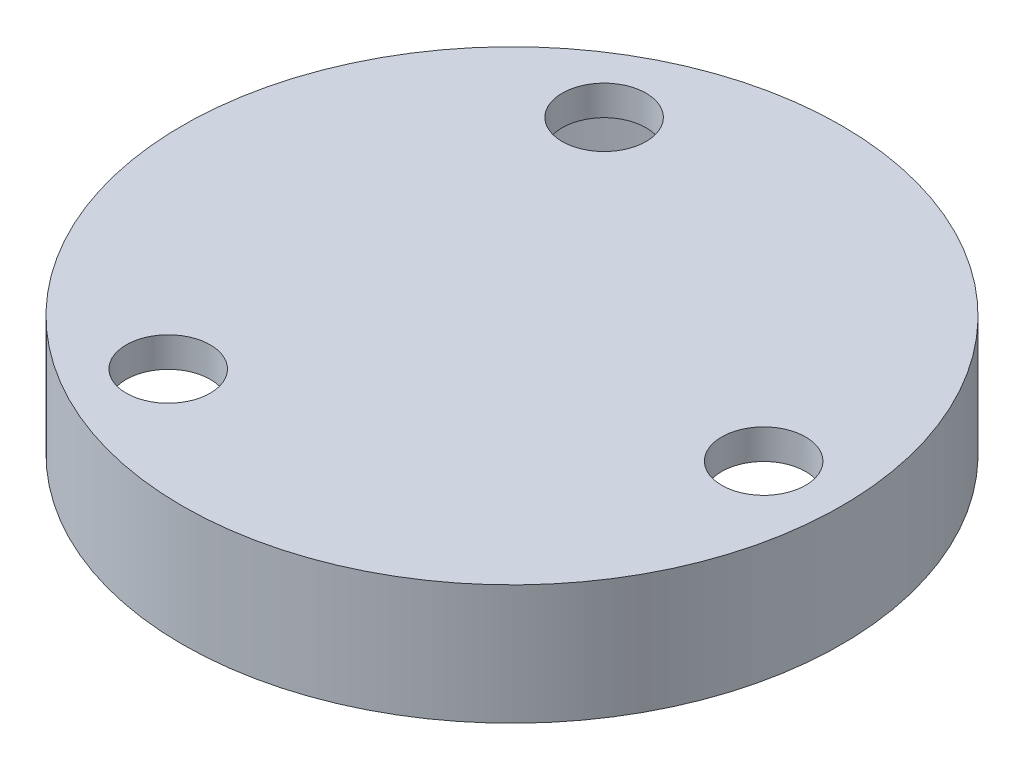
ISO-10303-21;
HEADER;
FILE_DESCRIPTION(('STEP AP214'),'2;1');
FILE_NAME('part.step','',(''),(''),'','','');
FILE_SCHEMA(('AUTOMOTIVE_DESIGN { 1 0 10303 214 1 1 1 1 }'));
ENDSEC;
DATA;
#1=APPLICATION_CONTEXT('core data for automotive mechanical design processes');
#2=APPLICATION_PROTOCOL_DEFINITION('international standard','automotive_design',2000,#1);
#3=PRODUCT_CONTEXT('',#1,'mechanical');
#4=PRODUCT('Part','Part','',(#3));
#5=PRODUCT_RELATED_PRODUCT_CATEGORY('part','',(#4));
#6=PRODUCT_DEFINITION_FORMATION('','',#4);
#7=PRODUCT_DEFINITION_CONTEXT('part definition',#1,'design');
#8=PRODUCT_DEFINITION('design','',#6,#7);
#9=PRODUCT_DEFINITION_SHAPE('','',#8);
#10=(LENGTH_UNIT() NAMED_UNIT(*) SI_UNIT(.MILLI.,.METRE.));
#11=(NAMED_UNIT(*) PLANE_ANGLE_UNIT() SI_UNIT($,.RADIAN.));
#12=(NAMED_UNIT(*) SI_UNIT($,.STERADIAN.) SOLID_ANGLE_UNIT());
#13=UNCERTAINTY_MEASURE_WITH_UNIT(LENGTH_MEASURE(1.E-05),#10,'distance_accuracy_value','');
#14=(GEOMETRIC_REPRESENTATION_CONTEXT(3) GLOBAL_UNCERTAINTY_ASSIGNED_CONTEXT((#13)) GLOBAL_UNIT_ASSIGNED_CONTEXT((#10,
#11,#12)) REPRESENTATION_CONTEXT('',''));
#15=CARTESIAN_POINT('',(0.,0.,0.));
#16=DIRECTION('',(0.,0.,1.));
#17=DIRECTION('',(1.,0.,0.));
#18=AXIS2_PLACEMENT_3D('',#15,#16,#17);
#19=CARTESIAN_POINT('',(0.,20.,0.));
#20=DIRECTION('',(0.,-1.,0.));
#21=DIRECTION('',(0.,0.,-1.));
#22=AXIS2_PLACEMENT_3D('',#19,#20,#21);
#23=CYLINDRICAL_SURFACE('',#22,55.);
#24=CARTESIAN_POINT('',(0.,20.,0.));
#25=DIRECTION('',(0.,1.,0.));
#26=DIRECTION('',(0.,0.,1.));
#27=AXIS2_PLACEMENT_3D('',#24,#25,#26);
#28=CIRCLE('',#27,55.);
#29=CARTESIAN_POINT('',(0.,20.,55.));
#30=VERTEX_POINT('',#29);
#31=EDGE_CURVE('E10',#30,#30,#28,.T.);
#32=ORIENTED_EDGE('',*,*,#31,.F.);
#33=EDGE_LOOP('',(#32));
#34=FACE_BOUND('',#33,.T.);
#35=CARTESIAN_POINT('',(0.,0.,0.));
#36=DIRECTION('',(0.,1.,0.));
#37=DIRECTION('',(0.,0.,1.));
#38=AXIS2_PLACEMENT_3D('',#35,#36,#37);
#39=CIRCLE('',#38,55.);
#40=CARTESIAN_POINT('',(0.,0.,55.));
#41=VERTEX_POINT('',#40);
#42=EDGE_CURVE('E44',#41,#41,#39,.T.);
#43=ORIENTED_EDGE('',*,*,#42,.T.);
#44=EDGE_LOOP('',(#43));
#45=FACE_BOUND('',#44,.T.);
#46=ADVANCED_FACE('F37',(#34,#45),#23,.T.);
#47=CARTESIAN_POINT('',(0.,20.,0.));
#48=DIRECTION('',(0.,1.,0.));
#49=DIRECTION('',(0.,0.,1.));
#50=AXIS2_PLACEMENT_3D('',#47,#48,#49);
#51=PLANE('',#50);
#52=CARTESIAN_POINT('',(42.,20.,0.));
#53=DIRECTION('',(0.,1.,0.));
#54=DIRECTION('',(0.,0.,1.));
#55=AXIS2_PLACEMENT_3D('',#52,#53,#54);
#56=CIRCLE('',#55,7.);
#57=CARTESIAN_POINT('',(42.,20.,7.));
#58=VERTEX_POINT('',#57);
#59=EDGE_CURVE('E70',#58,#58,#56,.T.);
#60=ORIENTED_EDGE('',*,*,#59,.F.);
#61=EDGE_LOOP('',(#60));
#62=FACE_BOUND('',#61,.T.);
#63=CARTESIAN_POINT('',(-21.0000000000002,20.,-36.3730669589463));
#64=DIRECTION('',(0.,1.,0.));
#65=DIRECTION('',(0.,0.,1.));
#66=AXIS2_PLACEMENT_3D('',#63,#64,#65);
#67=CIRCLE('',#66,7.);
#68=CARTESIAN_POINT('',(-21.0000000000002,20.,-29.3730669589463));
#69=VERTEX_POINT('',#68);
#70=EDGE_CURVE('E60',#69,#69,#67,.T.);
#71=ORIENTED_EDGE('',*,*,#70,.F.);
#72=EDGE_LOOP('',(#71));
#73=FACE_BOUND('',#72,.T.);
#74=CARTESIAN_POINT('',(-20.9999999999996,20.,36.3730669589466));
#75=DIRECTION('',(0.,1.,0.));
#76=DIRECTION('',(0.,0.,1.));
#77=AXIS2_PLACEMENT_3D('',#74,#75,#76);
#78=CIRCLE('',#77,7.);
#79=CARTESIAN_POINT('',(-20.9999999999996,20.,43.3730669589466));
#80=VERTEX_POINT('',#79);
#81=EDGE_CURVE('E57',#80,#80,#78,.T.);
#82=ORIENTED_EDGE('',*,*,#81,.F.);
#83=EDGE_LOOP('',(#82));
#84=FACE_BOUND('',#83,.T.);
#85=ORIENTED_EDGE('',*,*,#31,.T.);
#86=EDGE_LOOP('',(#85));
#87=FACE_BOUND('',#86,.T.);
#88=ADVANCED_FACE('F83',(#62,#73,#84,#87),#51,.T.);
#89=CARTESIAN_POINT('',(0.,0.,0.));
#90=DIRECTION('',(0.,1.,0.));
#91=DIRECTION('',(0.,0.,1.));
#92=AXIS2_PLACEMENT_3D('',#89,#90,#91);
#93=PLANE('',#92);
#94=CARTESIAN_POINT('',(0.,0.,0.));
#95=DIRECTION('',(0.,-1.,0.));
#96=DIRECTION('',(0.,0.,-1.));
#97=AXIS2_PLACEMENT_3D('',#94,#95,#96);
#98=CIRCLE('',#97,50.);
#99=CARTESIAN_POINT('',(0.,0.,-50.));
#100=VERTEX_POINT('',#99);
#101=EDGE_CURVE('E52',#100,#100,#98,.T.);
#102=ORIENTED_EDGE('',*,*,#101,.F.);
#103=EDGE_LOOP('',(#102));
#104=FACE_BOUND('',#103,.T.);
#105=ORIENTED_EDGE('',*,*,#42,.F.);
#106=EDGE_LOOP('',(#105));
#107=FACE_BOUND('',#106,.T.);
#108=ADVANCED_FACE('F80',(#104,#107),#93,.F.);
#109=CARTESIAN_POINT('',(0.,15.,0.));
#110=DIRECTION('',(0.,-1.,0.));
#111=DIRECTION('',(0.,0.,-1.));
#112=AXIS2_PLACEMENT_3D('',#109,#110,#111);
#113=CYLINDRICAL_SURFACE('',#112,50.);
#114=CARTESIAN_POINT('',(0.,15.,0.));
#115=DIRECTION('',(0.,-1.,0.));
#116=DIRECTION('',(0.,0.,-1.));
#117=AXIS2_PLACEMENT_3D('',#114,#115,#116);
#118=CIRCLE('',#117,50.);
#119=CARTESIAN_POINT('',(0.,15.,-50.));
#120=VERTEX_POINT('',#119);
#121=EDGE_CURVE('E49',#120,#120,#118,.T.);
#122=ORIENTED_EDGE('',*,*,#121,.F.);
#123=EDGE_LOOP('',(#122));
#124=FACE_BOUND('',#123,.T.);
#125=ORIENTED_EDGE('',*,*,#101,.T.);
#126=EDGE_LOOP('',(#125));
#127=FACE_BOUND('',#126,.T.);
#128=ADVANCED_FACE('F78',(#124,#127),#113,.F.);
#129=CARTESIAN_POINT('',(0.,15.,0.));
#130=DIRECTION('',(0.,-1.,0.));
#131=DIRECTION('',(0.,0.,-1.));
#132=AXIS2_PLACEMENT_3D('',#129,#130,#131);
#133=PLANE('',#132);
#134=CARTESIAN_POINT('',(42.,15.,0.));
#135=DIRECTION('',(0.,-1.,0.));
#136=DIRECTION('',(0.,0.,-1.));
#137=AXIS2_PLACEMENT_3D('',#134,#135,#136);
#138=CIRCLE('',#137,7.);
#139=CARTESIAN_POINT('',(42.,15.,-7.));
#140=VERTEX_POINT('',#139);
#141=EDGE_CURVE('E40',#140,#140,#138,.T.);
#142=ORIENTED_EDGE('',*,*,#141,.F.);
#143=EDGE_LOOP('',(#142));
#144=FACE_BOUND('',#143,.T.);
#145=CARTESIAN_POINT('',(-21.0000000000002,15.,-36.3730669589463));
#146=DIRECTION('',(0.,-1.,0.));
#147=DIRECTION('',(0.,0.,-1.));
#148=AXIS2_PLACEMENT_3D('',#145,#146,#147);
#149=CIRCLE('',#148,7.);
#150=CARTESIAN_POINT('',(-21.0000000000002,15.,-43.3730669589463));
#151=VERTEX_POINT('',#150);
#152=EDGE_CURVE('E58',#151,#151,#149,.T.);
#153=ORIENTED_EDGE('',*,*,#152,.F.);
#154=EDGE_LOOP('',(#153));
#155=FACE_BOUND('',#154,.T.);
#156=CARTESIAN_POINT('',(-20.9999999999996,15.,36.3730669589466));
#157=DIRECTION('',(0.,-1.,0.));
#158=DIRECTION('',(0.,0.,-1.));
#159=AXIS2_PLACEMENT_3D('',#156,#157,#158);
#160=CIRCLE('',#159,7.);
#161=CARTESIAN_POINT('',(-20.9999999999996,15.,29.3730669589466));
#162=VERTEX_POINT('',#161);
#163=EDGE_CURVE('E55',#162,#162,#160,.T.);
#164=ORIENTED_EDGE('',*,*,#163,.F.);
#165=EDGE_LOOP('',(#164));
#166=FACE_BOUND('',#165,.T.);
#167=ORIENTED_EDGE('',*,*,#121,.T.);
#168=EDGE_LOOP('',(#167));
#169=FACE_BOUND('',#168,.T.);
#170=ADVANCED_FACE('F101',(#144,#155,#166,#169),#133,.T.);
#171=CARTESIAN_POINT('',(-20.9999999999996,20.,36.3730669589466));
#172=DIRECTION('',(0.,1.,0.));
#173=DIRECTION('',(0.,0.,1.));
#174=AXIS2_PLACEMENT_3D('',#171,#172,#173);
#175=CYLINDRICAL_SURFACE('',#174,7.);
#176=ORIENTED_EDGE('',*,*,#163,.T.);
#177=EDGE_LOOP('',(#176));
#178=FACE_BOUND('',#177,.T.);
#179=ORIENTED_EDGE('',*,*,#81,.T.);
#180=EDGE_LOOP('',(#179));
#181=FACE_BOUND('',#180,.T.);
#182=ADVANCED_FACE('F104',(#178,#181),#175,.F.);
#183=CARTESIAN_POINT('',(-21.0000000000002,20.,-36.3730669589463));
#184=DIRECTION('',(0.,1.,0.));
#185=DIRECTION('',(0.,0.,1.));
#186=AXIS2_PLACEMENT_3D('',#183,#184,#185);
#187=CYLINDRICAL_SURFACE('',#186,7.);
#188=ORIENTED_EDGE('',*,*,#152,.T.);
#189=EDGE_LOOP('',(#188));
#190=FACE_BOUND('',#189,.T.);
#191=ORIENTED_EDGE('',*,*,#70,.T.);
#192=EDGE_LOOP('',(#191));
#193=FACE_BOUND('',#192,.T.);
#194=ADVANCED_FACE('F108',(#190,#193),#187,.F.);
#195=CARTESIAN_POINT('',(42.,20.,0.));
#196=DIRECTION('',(0.,1.,0.));
#197=DIRECTION('',(0.,0.,1.));
#198=AXIS2_PLACEMENT_3D('',#195,#196,#197);
#199=CYLINDRICAL_SURFACE('',#198,7.);
#200=ORIENTED_EDGE('',*,*,#141,.T.);
#201=EDGE_LOOP('',(#200));
#202=FACE_BOUND('',#201,.T.);
#203=ORIENTED_EDGE('',*,*,#59,.T.);
#204=EDGE_LOOP('',(#203));
#205=FACE_BOUND('',#204,.T.);
#206=ADVANCED_FACE('F112',(#202,#205),#199,.F.);
#207=CLOSED_SHELL('',(#46,#88,#108,#128,#170,#182,#194,#206));
#208=MANIFOLD_SOLID_BREP('B2',#207);
#209=ADVANCED_BREP_SHAPE_REPRESENTATION('',(#18,#208),#14);
#210=SHAPE_DEFINITION_REPRESENTATION(#9,#209);
ENDSEC;
END-ISO-10303-21;
